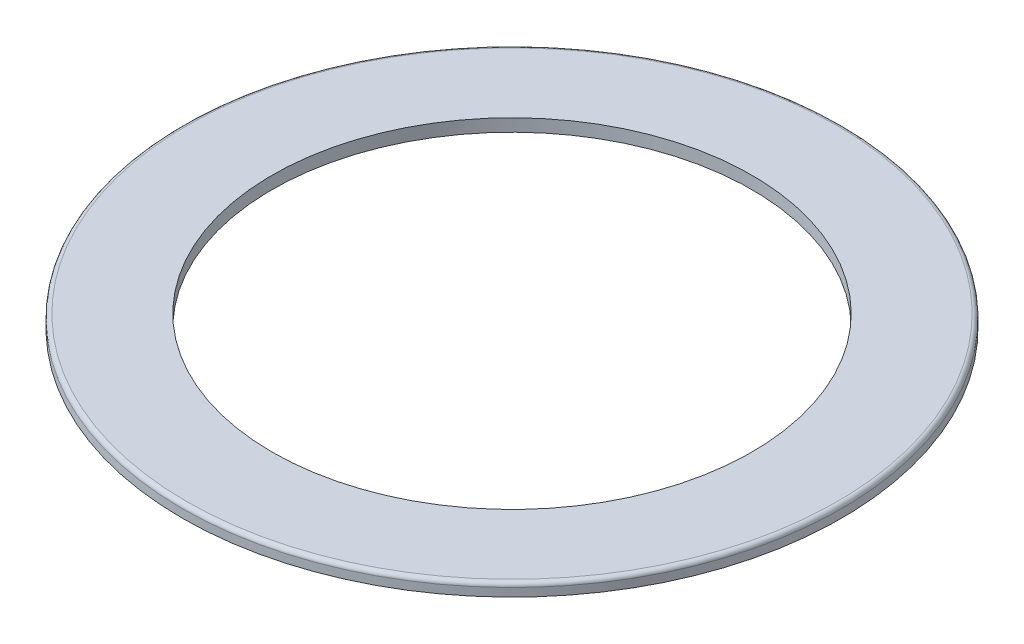
ISO-10303-21;
HEADER;
FILE_DESCRIPTION(('STEP AP214'),'2;1');
FILE_NAME('part.step','',(''),(''),'','','');
FILE_SCHEMA(('AUTOMOTIVE_DESIGN { 1 0 10303 214 1 1 1 1 }'));
ENDSEC;
DATA;
#1=APPLICATION_CONTEXT('core data for automotive mechanical design processes');
#2=APPLICATION_PROTOCOL_DEFINITION('international standard','automotive_design',2000,#1);
#3=PRODUCT_CONTEXT('',#1,'mechanical');
#4=PRODUCT('Part','Part','',(#3));
#5=PRODUCT_RELATED_PRODUCT_CATEGORY('part','',(#4));
#6=PRODUCT_DEFINITION_FORMATION('','',#4);
#7=PRODUCT_DEFINITION_CONTEXT('part definition',#1,'design');
#8=PRODUCT_DEFINITION('design','',#6,#7);
#9=PRODUCT_DEFINITION_SHAPE('','',#8);
#10=(LENGTH_UNIT() NAMED_UNIT(*) SI_UNIT(.MILLI.,.METRE.));
#11=(NAMED_UNIT(*) PLANE_ANGLE_UNIT() SI_UNIT($,.RADIAN.));
#12=(NAMED_UNIT(*) SI_UNIT($,.STERADIAN.) SOLID_ANGLE_UNIT());
#13=UNCERTAINTY_MEASURE_WITH_UNIT(LENGTH_MEASURE(1.E-05),#10,'distance_accuracy_value','');
#14=(GEOMETRIC_REPRESENTATION_CONTEXT(3) GLOBAL_UNCERTAINTY_ASSIGNED_CONTEXT((#13)) GLOBAL_UNIT_ASSIGNED_CONTEXT((#10,
#11,#12)) REPRESENTATION_CONTEXT('',''));
#15=CARTESIAN_POINT('',(0.,0.,0.));
#16=DIRECTION('',(0.,0.,1.));
#17=DIRECTION('',(1.,0.,0.));
#18=AXIS2_PLACEMENT_3D('',#15,#16,#17);
#19=CARTESIAN_POINT('',(7.9,-0.15,0.));
#20=DIRECTION('',(0.,-1.,0.));
#21=DIRECTION('',(0.,0.,-1.));
#22=AXIS2_PLACEMENT_3D('',#19,#20,#21);
#23=PLANE('',#22);
#24=CARTESIAN_POINT('',(0.,-0.15,0.));
#25=DIRECTION('',(0.,1.,0.));
#26=DIRECTION('',(0.,0.,1.));
#27=AXIS2_PLACEMENT_3D('',#24,#25,#26);
#28=CIRCLE('',#27,5.75);
#29=CARTESIAN_POINT('',(0.,-0.15,5.75));
#30=VERTEX_POINT('',#29);
#31=EDGE_CURVE('E50',#30,#30,#28,.T.);
#32=ORIENTED_EDGE('',*,*,#31,.T.);
#33=EDGE_LOOP('',(#32));
#34=FACE_BOUND('',#33,.T.);
#35=CARTESIAN_POINT('',(0.,-0.15,0.));
#36=DIRECTION('',(0.,1.,0.));
#37=DIRECTION('',(0.,0.,1.));
#38=AXIS2_PLACEMENT_3D('',#35,#36,#37);
#39=CIRCLE('',#38,7.9);
#40=CARTESIAN_POINT('',(0.,-0.15,7.9));
#41=VERTEX_POINT('',#40);
#42=EDGE_CURVE('E61',#41,#41,#39,.T.);
#43=ORIENTED_EDGE('',*,*,#42,.F.);
#44=EDGE_LOOP('',(#43));
#45=FACE_BOUND('',#44,.T.);
#46=ADVANCED_FACE('F36',(#34,#45),#23,.T.);
#47=CARTESIAN_POINT('',(0.,-0.15,0.));
#48=DIRECTION('',(0.,1.,0.));
#49=DIRECTION('',(0.,0.,1.));
#50=AXIS2_PLACEMENT_3D('',#47,#48,#49);
#51=CYLINDRICAL_SURFACE('',#50,5.75);
#52=CARTESIAN_POINT('',(0.,0.15,0.));
#53=DIRECTION('',(0.,1.,0.));
#54=DIRECTION('',(0.,0.,1.));
#55=AXIS2_PLACEMENT_3D('',#52,#53,#54);
#56=CIRCLE('',#55,5.75);
#57=CARTESIAN_POINT('',(0.,0.15,5.75));
#58=VERTEX_POINT('',#57);
#59=EDGE_CURVE('E55',#58,#58,#56,.T.);
#60=ORIENTED_EDGE('',*,*,#59,.T.);
#61=EDGE_LOOP('',(#60));
#62=FACE_BOUND('',#61,.T.);
#63=ORIENTED_EDGE('',*,*,#31,.F.);
#64=EDGE_LOOP('',(#63));
#65=FACE_BOUND('',#64,.T.);
#66=ADVANCED_FACE('F68',(#62,#65),#51,.F.);
#67=CARTESIAN_POINT('',(5.75,0.15,0.));
#68=DIRECTION('',(0.,1.,0.));
#69=DIRECTION('',(0.,0.,1.));
#70=AXIS2_PLACEMENT_3D('',#67,#68,#69);
#71=PLANE('',#70);
#72=CARTESIAN_POINT('',(0.,0.15,0.));
#73=DIRECTION('',(0.,1.,0.));
#74=DIRECTION('',(0.,0.,1.));
#75=AXIS2_PLACEMENT_3D('',#72,#73,#74);
#76=CIRCLE('',#75,7.79999999917094);
#77=CARTESIAN_POINT('',(0.,0.15,7.79999999917094));
#78=VERTEX_POINT('',#77);
#79=EDGE_CURVE('E44',#78,#78,#76,.T.);
#80=ORIENTED_EDGE('',*,*,#79,.T.);
#81=EDGE_LOOP('',(#80));
#82=FACE_BOUND('',#81,.T.);
#83=ORIENTED_EDGE('',*,*,#59,.F.);
#84=EDGE_LOOP('',(#83));
#85=FACE_BOUND('',#84,.T.);
#86=ADVANCED_FACE('F73',(#82,#85),#71,.T.);
#87=CARTESIAN_POINT('',(0.,-0.15,0.));
#88=DIRECTION('',(0.,1.,0.));
#89=DIRECTION('',(0.,0.,1.));
#90=AXIS2_PLACEMENT_3D('',#87,#88,#89);
#91=CYLINDRICAL_SURFACE('',#90,7.9);
#92=CARTESIAN_POINT('',(0.,0.0499999991709422,0.));
#93=DIRECTION('',(0.,1.,0.));
#94=DIRECTION('',(0.,0.,1.));
#95=AXIS2_PLACEMENT_3D('',#92,#93,#94);
#96=CIRCLE('',#95,7.9);
#97=CARTESIAN_POINT('',(0.,0.0499999991709422,7.9));
#98=VERTEX_POINT('',#97);
#99=EDGE_CURVE('E10',#98,#98,#96,.F.);
#100=ORIENTED_EDGE('',*,*,#99,.T.);
#101=EDGE_LOOP('',(#100));
#102=FACE_BOUND('',#101,.T.);
#103=ORIENTED_EDGE('',*,*,#42,.T.);
#104=EDGE_LOOP('',(#103));
#105=FACE_BOUND('',#104,.T.);
#106=ADVANCED_FACE('F65',(#102,#105),#91,.T.);
#107=CARTESIAN_POINT('',(0.,0.0499999991709422,0.));
#108=DIRECTION('',(0.,1.,0.));
#109=DIRECTION('',(0.,0.,1.));
#110=AXIS2_PLACEMENT_3D('',#107,#108,#109);
#111=TOROIDAL_SURFACE('',#110,7.79999999917094,0.100000000829058);
#112=ORIENTED_EDGE('',*,*,#99,.F.);
#113=EDGE_LOOP('',(#112));
#114=FACE_BOUND('',#113,.T.);
#115=ORIENTED_EDGE('',*,*,#79,.F.);
#116=EDGE_LOOP('',(#115));
#117=FACE_BOUND('',#116,.T.);
#118=ADVANCED_FACE('F38',(#114,#117),#111,.T.);
#119=CLOSED_SHELL('',(#46,#66,#86,#106,#118));
#120=MANIFOLD_SOLID_BREP('B2',#119);
#121=ADVANCED_BREP_SHAPE_REPRESENTATION('',(#18,#120),#14);
#122=SHAPE_DEFINITION_REPRESENTATION(#9,#121);
ENDSEC;
END-ISO-10303-21;
